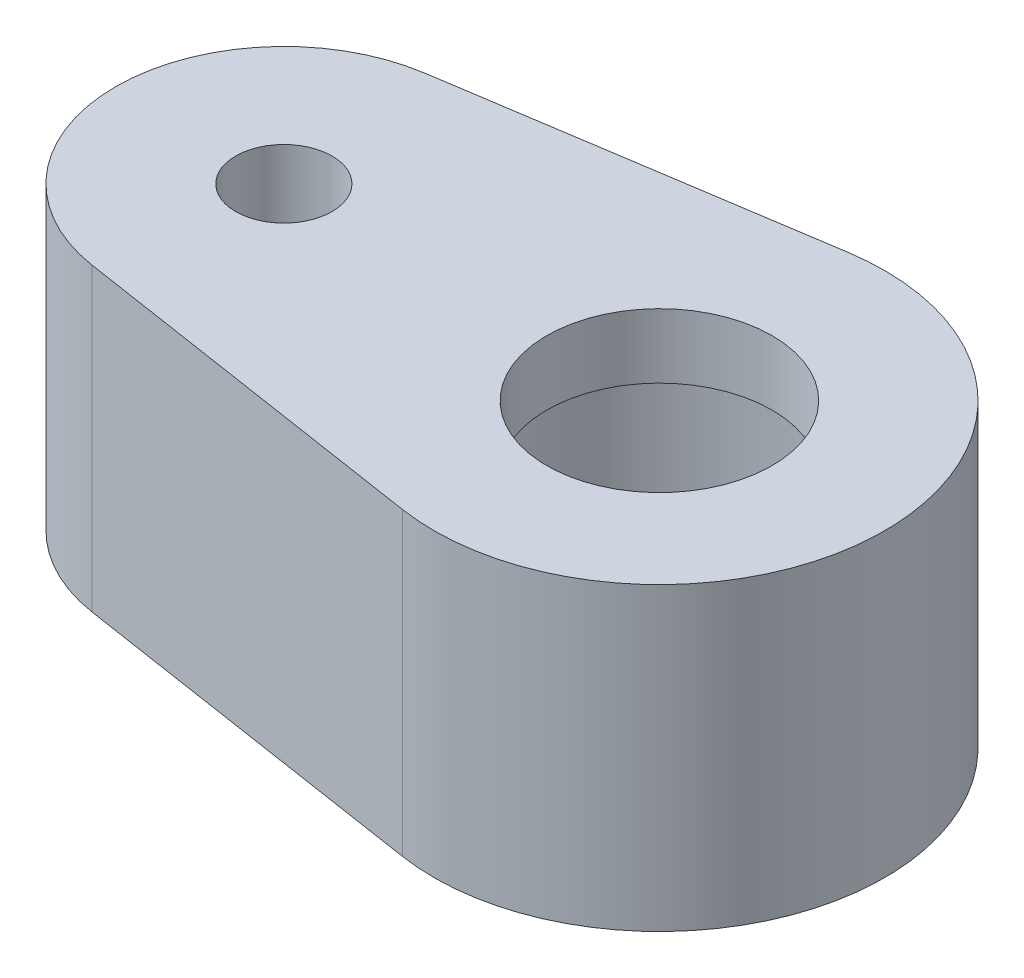
ISO-10303-21;
HEADER;
FILE_DESCRIPTION(('STEP AP214'),'2;1');
FILE_NAME('part.step','',(''),(''),'','','');
FILE_SCHEMA(('AUTOMOTIVE_DESIGN { 1 0 10303 214 1 1 1 1 }'));
ENDSEC;
DATA;
#1=APPLICATION_CONTEXT('core data for automotive mechanical design processes');
#2=APPLICATION_PROTOCOL_DEFINITION('international standard','automotive_design',2000,#1);
#3=PRODUCT_CONTEXT('',#1,'mechanical');
#4=PRODUCT('Part','Part','',(#3));
#5=PRODUCT_RELATED_PRODUCT_CATEGORY('part','',(#4));
#6=PRODUCT_DEFINITION_FORMATION('','',#4);
#7=PRODUCT_DEFINITION_CONTEXT('part definition',#1,'design');
#8=PRODUCT_DEFINITION('design','',#6,#7);
#9=PRODUCT_DEFINITION_SHAPE('','',#8);
#10=(LENGTH_UNIT() NAMED_UNIT(*) SI_UNIT(.MILLI.,.METRE.));
#11=(NAMED_UNIT(*) PLANE_ANGLE_UNIT() SI_UNIT($,.RADIAN.));
#12=(NAMED_UNIT(*) SI_UNIT($,.STERADIAN.) SOLID_ANGLE_UNIT());
#13=UNCERTAINTY_MEASURE_WITH_UNIT(LENGTH_MEASURE(1.E-05),#10,'distance_accuracy_value','');
#14=(GEOMETRIC_REPRESENTATION_CONTEXT(3) GLOBAL_UNCERTAINTY_ASSIGNED_CONTEXT((#13)) GLOBAL_UNIT_ASSIGNED_CONTEXT((#10,
#11,#12)) REPRESENTATION_CONTEXT('',''));
#15=CARTESIAN_POINT('',(0.,0.,0.));
#16=DIRECTION('',(0.,0.,1.));
#17=DIRECTION('',(1.,0.,0.));
#18=AXIS2_PLACEMENT_3D('',#15,#16,#17);
#19=CARTESIAN_POINT('',(-2.5,-1.,0.));
#20=DIRECTION('',(0.,1.,0.));
#21=DIRECTION('',(0.,0.,1.));
#22=AXIS2_PLACEMENT_3D('',#19,#20,#21);
#23=CYLINDRICAL_SURFACE('',#22,1.12);
#24=DIRECTION('',(0.,1.,0.));
#25=VECTOR('',#24,1.);
#26=CARTESIAN_POINT('',(-2.67024,-1.,1.10698615275892));
#27=LINE('',#26,#25);
#28=CARTESIAN_POINT('',(-2.67024,-1.,1.10698615275892));
#29=VERTEX_POINT('',#28);
#30=CARTESIAN_POINT('',(-2.67024,1.,1.10698615275892));
#31=VERTEX_POINT('',#30);
#32=EDGE_CURVE('E36',#29,#31,#27,.T.);
#33=ORIENTED_EDGE('',*,*,#32,.T.);
#34=CARTESIAN_POINT('',(-2.5,1.,0.));
#35=DIRECTION('',(0.,1.,0.));
#36=DIRECTION('',(0.,0.,1.));
#37=AXIS2_PLACEMENT_3D('',#34,#35,#36);
#38=CIRCLE('',#37,1.12);
#39=CARTESIAN_POINT('',(-2.67024,1.,-1.10698615275892));
#40=VERTEX_POINT('',#39);
#41=EDGE_CURVE('E73',#40,#31,#38,.T.);
#42=ORIENTED_EDGE('',*,*,#41,.F.);
#43=DIRECTION('',(0.,1.,0.));
#44=VECTOR('',#43,1.);
#45=CARTESIAN_POINT('',(-2.67024,-1.,-1.10698615275892));
#46=LINE('',#45,#44);
#47=CARTESIAN_POINT('',(-2.67024,-1.,-1.10698615275892));
#48=VERTEX_POINT('',#47);
#49=EDGE_CURVE('E11',#48,#40,#46,.T.);
#50=ORIENTED_EDGE('',*,*,#49,.F.);
#51=CARTESIAN_POINT('',(-2.5,-1.,0.));
#52=DIRECTION('',(0.,1.,0.));
#53=DIRECTION('',(0.,0.,1.));
#54=AXIS2_PLACEMENT_3D('',#51,#52,#53);
#55=CIRCLE('',#54,1.12);
#56=EDGE_CURVE('E74',#48,#29,#55,.T.);
#57=ORIENTED_EDGE('',*,*,#56,.T.);
#58=EDGE_LOOP('',(#33,#42,#50,#57));
#59=FACE_BOUND('',#58,.T.);
#60=ADVANCED_FACE('F33',(#59),#23,.T.);
#61=CARTESIAN_POINT('',(-2.67024,-1.,-1.10698615275892));
#62=DIRECTION('',(-0.152,0.,-0.988380493534752));
#63=DIRECTION('',(-0.988380493534752,0.,0.152));
#64=AXIS2_PLACEMENT_3D('',#61,#62,#63);
#65=PLANE('',#64);
#66=ORIENTED_EDGE('',*,*,#49,.T.);
#67=DIRECTION('',(-0.988380493534752,0.,0.152));
#68=VECTOR('',#67,1.);
#69=CARTESIAN_POINT('',(-2.67024,1.,-1.10698615275892));
#70=LINE('',#69,#68);
#71=CARTESIAN_POINT('',(-0.228,1.,-1.48257074030213));
#72=VERTEX_POINT('',#71);
#73=EDGE_CURVE('E90',#72,#40,#70,.T.);
#74=ORIENTED_EDGE('',*,*,#73,.F.);
#75=DIRECTION('',(0.,1.,0.));
#76=VECTOR('',#75,1.);
#77=CARTESIAN_POINT('',(-0.228,-1.,-1.48257074030213));
#78=LINE('',#77,#76);
#79=CARTESIAN_POINT('',(-0.228,-1.,-1.48257074030213));
#80=VERTEX_POINT('',#79);
#81=EDGE_CURVE('E41',#80,#72,#78,.T.);
#82=ORIENTED_EDGE('',*,*,#81,.F.);
#83=DIRECTION('',(-0.988380493534752,0.,0.152));
#84=VECTOR('',#83,1.);
#85=CARTESIAN_POINT('',(-2.67024,-1.,-1.10698615275892));
#86=LINE('',#85,#84);
#87=EDGE_CURVE('E79',#80,#48,#86,.T.);
#88=ORIENTED_EDGE('',*,*,#87,.T.);
#89=EDGE_LOOP('',(#66,#74,#82,#88));
#90=FACE_BOUND('',#89,.T.);
#91=ADVANCED_FACE('F110',(#90),#65,.T.);
#92=CARTESIAN_POINT('',(0.,-1.,0.));
#93=DIRECTION('',(0.,1.,0.));
#94=DIRECTION('',(0.,0.,1.));
#95=AXIS2_PLACEMENT_3D('',#92,#93,#94);
#96=CYLINDRICAL_SURFACE('',#95,1.5);
#97=ORIENTED_EDGE('',*,*,#81,.T.);
#98=CARTESIAN_POINT('',(0.,1.,0.));
#99=DIRECTION('',(0.,1.,0.));
#100=DIRECTION('',(0.,0.,1.));
#101=AXIS2_PLACEMENT_3D('',#98,#99,#100);
#102=CIRCLE('',#101,1.5);
#103=CARTESIAN_POINT('',(-0.228,1.,1.48257074030213));
#104=VERTEX_POINT('',#103);
#105=EDGE_CURVE('E86',#104,#72,#102,.T.);
#106=ORIENTED_EDGE('',*,*,#105,.F.);
#107=DIRECTION('',(0.,1.,0.));
#108=VECTOR('',#107,1.);
#109=CARTESIAN_POINT('',(-0.228,-1.,1.48257074030213));
#110=LINE('',#109,#108);
#111=CARTESIAN_POINT('',(-0.228,-1.,1.48257074030213));
#112=VERTEX_POINT('',#111);
#113=EDGE_CURVE('E78',#112,#104,#110,.T.);
#114=ORIENTED_EDGE('',*,*,#113,.F.);
#115=CARTESIAN_POINT('',(0.,-1.,0.));
#116=DIRECTION('',(0.,1.,0.));
#117=DIRECTION('',(0.,0.,1.));
#118=AXIS2_PLACEMENT_3D('',#115,#116,#117);
#119=CIRCLE('',#118,1.5);
#120=EDGE_CURVE('E103',#112,#80,#119,.T.);
#121=ORIENTED_EDGE('',*,*,#120,.T.);
#122=EDGE_LOOP('',(#97,#106,#114,#121));
#123=FACE_BOUND('',#122,.T.);
#124=ADVANCED_FACE('F107',(#123),#96,.T.);
#125=CARTESIAN_POINT('',(-2.67024,-1.,1.10698615275892));
#126=DIRECTION('',(-0.152,0.,0.988380493534752));
#127=DIRECTION('',(0.988380493534752,0.,0.152));
#128=AXIS2_PLACEMENT_3D('',#125,#126,#127);
#129=PLANE('',#128);
#130=ORIENTED_EDGE('',*,*,#113,.T.);
#131=DIRECTION('',(0.988380493534752,0.,0.152));
#132=VECTOR('',#131,1.);
#133=CARTESIAN_POINT('',(-2.67024,1.,1.10698615275892));
#134=LINE('',#133,#132);
#135=EDGE_CURVE('E81',#31,#104,#134,.T.);
#136=ORIENTED_EDGE('',*,*,#135,.F.);
#137=ORIENTED_EDGE('',*,*,#32,.F.);
#138=DIRECTION('',(0.988380493534752,0.,0.152));
#139=VECTOR('',#138,1.);
#140=CARTESIAN_POINT('',(-2.67024,-1.,1.10698615275892));
#141=LINE('',#140,#139);
#142=EDGE_CURVE('E101',#29,#112,#141,.T.);
#143=ORIENTED_EDGE('',*,*,#142,.T.);
#144=EDGE_LOOP('',(#130,#136,#137,#143));
#145=FACE_BOUND('',#144,.T.);
#146=ADVANCED_FACE('F82',(#145),#129,.T.);
#147=CARTESIAN_POINT('',(-2.5,-1.,0.));
#148=DIRECTION('',(0.,1.,0.));
#149=DIRECTION('',(0.,0.,1.));
#150=AXIS2_PLACEMENT_3D('',#147,#148,#149);
#151=PLANE('',#150);
#152=CARTESIAN_POINT('',(-2.5,-1.,0.));
#153=DIRECTION('',(0.,1.,0.));
#154=DIRECTION('',(0.,0.,1.));
#155=AXIS2_PLACEMENT_3D('',#152,#153,#154);
#156=CIRCLE('',#155,0.3207);
#157=CARTESIAN_POINT('',(-2.5,-1.,0.3207));
#158=VERTEX_POINT('',#157);
#159=EDGE_CURVE('E219',#158,#158,#156,.F.);
#160=ORIENTED_EDGE('',*,*,#159,.F.);
#161=EDGE_LOOP('',(#160));
#162=FACE_BOUND('',#161,.T.);
#163=CARTESIAN_POINT('',(0.,-1.,0.));
#164=DIRECTION('',(0.,-1.,0.));
#165=DIRECTION('',(0.,0.,-1.));
#166=AXIS2_PLACEMENT_3D('',#163,#164,#165);
#167=CIRCLE('',#166,0.75);
#168=CARTESIAN_POINT('',(0.,-1.,-0.75));
#169=VERTEX_POINT('',#168);
#170=EDGE_CURVE('E229',#169,#169,#167,.T.);
#171=ORIENTED_EDGE('',*,*,#170,.F.);
#172=EDGE_LOOP('',(#171));
#173=FACE_BOUND('',#172,.T.);
#174=ORIENTED_EDGE('',*,*,#56,.F.);
#175=ORIENTED_EDGE('',*,*,#87,.F.);
#176=ORIENTED_EDGE('',*,*,#120,.F.);
#177=ORIENTED_EDGE('',*,*,#142,.F.);
#178=EDGE_LOOP('',(#174,#175,#176,#177));
#179=FACE_BOUND('',#178,.T.);
#180=ADVANCED_FACE('F112',(#162,#173,#179),#151,.F.);
#181=CARTESIAN_POINT('',(-2.5,1.,0.));
#182=DIRECTION('',(0.,1.,0.));
#183=DIRECTION('',(0.,0.,1.));
#184=AXIS2_PLACEMENT_3D('',#181,#182,#183);
#185=PLANE('',#184);
#186=CARTESIAN_POINT('',(-2.5,1.,0.));
#187=DIRECTION('',(0.,1.,0.));
#188=DIRECTION('',(0.,0.,1.));
#189=AXIS2_PLACEMENT_3D('',#186,#187,#188);
#190=CIRCLE('',#189,0.3207);
#191=CARTESIAN_POINT('',(-2.5,1.,0.3207));
#192=VERTEX_POINT('',#191);
#193=EDGE_CURVE('E217',#192,#192,#190,.T.);
#194=ORIENTED_EDGE('',*,*,#193,.F.);
#195=EDGE_LOOP('',(#194));
#196=FACE_BOUND('',#195,.T.);
#197=CARTESIAN_POINT('',(0.,1.,0.));
#198=DIRECTION('',(0.,-1.,0.));
#199=DIRECTION('',(0.,0.,-1.));
#200=AXIS2_PLACEMENT_3D('',#197,#198,#199);
#201=CIRCLE('',#200,0.75);
#202=CARTESIAN_POINT('',(0.,1.,-0.75));
#203=VERTEX_POINT('',#202);
#204=EDGE_CURVE('E232',#203,#203,#201,.T.);
#205=ORIENTED_EDGE('',*,*,#204,.T.);
#206=EDGE_LOOP('',(#205));
#207=FACE_BOUND('',#206,.T.);
#208=ORIENTED_EDGE('',*,*,#41,.T.);
#209=ORIENTED_EDGE('',*,*,#135,.T.);
#210=ORIENTED_EDGE('',*,*,#105,.T.);
#211=ORIENTED_EDGE('',*,*,#73,.T.);
#212=EDGE_LOOP('',(#208,#209,#210,#211));
#213=FACE_BOUND('',#212,.T.);
#214=ADVANCED_FACE('F89',(#196,#207,#213),#185,.T.);
#215=CARTESIAN_POINT('',(0.,-1.,0.));
#216=DIRECTION('',(0.,-1.,0.));
#217=DIRECTION('',(0.,0.,-1.));
#218=AXIS2_PLACEMENT_3D('',#215,#216,#217);
#219=CYLINDRICAL_SURFACE('',#218,1.145);
#220=CARTESIAN_POINT('',(0.,0.465,0.));
#221=DIRECTION('',(0.,-1.,0.));
#222=DIRECTION('',(0.,0.,-1.));
#223=AXIS2_PLACEMENT_3D('',#220,#221,#222);
#224=CIRCLE('',#223,1.145);
#225=CARTESIAN_POINT('',(0.,0.465,-1.145));
#226=VERTEX_POINT('',#225);
#227=EDGE_CURVE('E91',#226,#226,#224,.T.);
#228=ORIENTED_EDGE('',*,*,#227,.F.);
#229=EDGE_LOOP('',(#228));
#230=FACE_BOUND('',#229,.T.);
#231=CARTESIAN_POINT('',(0.,-0.465,0.));
#232=DIRECTION('',(0.,-1.,0.));
#233=DIRECTION('',(0.,0.,-1.));
#234=AXIS2_PLACEMENT_3D('',#231,#232,#233);
#235=CIRCLE('',#234,1.145);
#236=CARTESIAN_POINT('',(0.,-0.465,-1.145));
#237=VERTEX_POINT('',#236);
#238=EDGE_CURVE('E220',#237,#237,#235,.T.);
#239=ORIENTED_EDGE('',*,*,#238,.T.);
#240=EDGE_LOOP('',(#239));
#241=FACE_BOUND('',#240,.T.);
#242=ADVANCED_FACE('F120',(#230,#241),#219,.F.);
#243=CARTESIAN_POINT('',(0.,0.465,0.));
#244=DIRECTION('',(0.,-1.,0.));
#245=DIRECTION('',(0.,0.,-1.));
#246=AXIS2_PLACEMENT_3D('',#243,#244,#245);
#247=CONICAL_SURFACE('',#246,1.145,1.30899693899575);
#248=CARTESIAN_POINT('',(0.,0.570839931010292,0.));
#249=DIRECTION('',(0.,-1.,0.));
#250=DIRECTION('',(0.,0.,-1.));
#251=AXIS2_PLACEMENT_3D('',#248,#249,#250);
#252=CIRCLE('',#251,0.75);
#253=CARTESIAN_POINT('',(0.,0.570839931010292,-0.75));
#254=VERTEX_POINT('',#253);
#255=EDGE_CURVE('E94',#254,#254,#252,.T.);
#256=ORIENTED_EDGE('',*,*,#255,.F.);
#257=EDGE_LOOP('',(#256));
#258=FACE_BOUND('',#257,.T.);
#259=ORIENTED_EDGE('',*,*,#227,.T.);
#260=EDGE_LOOP('',(#259));
#261=FACE_BOUND('',#260,.T.);
#262=ADVANCED_FACE('F150',(#258,#261),#247,.F.);
#263=CARTESIAN_POINT('',(0.,-1.,0.));
#264=DIRECTION('',(0.,-1.,0.));
#265=DIRECTION('',(0.,0.,-1.));
#266=AXIS2_PLACEMENT_3D('',#263,#264,#265);
#267=CYLINDRICAL_SURFACE('',#266,0.75);
#268=ORIENTED_EDGE('',*,*,#204,.F.);
#269=EDGE_LOOP('',(#268));
#270=FACE_BOUND('',#269,.T.);
#271=ORIENTED_EDGE('',*,*,#255,.T.);
#272=EDGE_LOOP('',(#271));
#273=FACE_BOUND('',#272,.T.);
#274=ADVANCED_FACE('F161',(#270,#273),#267,.F.);
#275=CARTESIAN_POINT('',(0.,-1.,0.));
#276=DIRECTION('',(0.,-1.,0.));
#277=DIRECTION('',(0.,0.,-1.));
#278=AXIS2_PLACEMENT_3D('',#275,#276,#277);
#279=CYLINDRICAL_SURFACE('',#278,0.75);
#280=CARTESIAN_POINT('',(0.,-0.570839931010292,0.));
#281=DIRECTION('',(0.,-1.,0.));
#282=DIRECTION('',(0.,0.,-1.));
#283=AXIS2_PLACEMENT_3D('',#280,#281,#282);
#284=CIRCLE('',#283,0.75);
#285=CARTESIAN_POINT('',(0.,-0.570839931010292,-0.75));
#286=VERTEX_POINT('',#285);
#287=EDGE_CURVE('E223',#286,#286,#284,.T.);
#288=ORIENTED_EDGE('',*,*,#287,.F.);
#289=EDGE_LOOP('',(#288));
#290=FACE_BOUND('',#289,.T.);
#291=ORIENTED_EDGE('',*,*,#170,.T.);
#292=EDGE_LOOP('',(#291));
#293=FACE_BOUND('',#292,.T.);
#294=ADVANCED_FACE('F171',(#290,#293),#279,.F.);
#295=CARTESIAN_POINT('',(0.,-0.570839931010292,0.));
#296=DIRECTION('',(0.,1.,0.));
#297=DIRECTION('',(0.,0.,1.));
#298=AXIS2_PLACEMENT_3D('',#295,#296,#297);
#299=CONICAL_SURFACE('',#298,0.75,1.30899693899575);
#300=ORIENTED_EDGE('',*,*,#238,.F.);
#301=EDGE_LOOP('',(#300));
#302=FACE_BOUND('',#301,.T.);
#303=ORIENTED_EDGE('',*,*,#287,.T.);
#304=EDGE_LOOP('',(#303));
#305=FACE_BOUND('',#304,.T.);
#306=ADVANCED_FACE('F181',(#302,#305),#299,.F.);
#307=CARTESIAN_POINT('',(-2.5,-1.001,0.));
#308=DIRECTION('',(0.,1.,0.));
#309=DIRECTION('',(0.,0.,1.));
#310=AXIS2_PLACEMENT_3D('',#307,#308,#309);
#311=CYLINDRICAL_SURFACE('',#310,0.3207);
#312=ORIENTED_EDGE('',*,*,#193,.T.);
#313=EDGE_LOOP('',(#312));
#314=FACE_BOUND('',#313,.T.);
#315=ORIENTED_EDGE('',*,*,#159,.T.);
#316=EDGE_LOOP('',(#315));
#317=FACE_BOUND('',#316,.T.);
#318=ADVANCED_FACE('F190',(#314,#317),#311,.F.);
#319=CLOSED_SHELL('',(#60,#91,#124,#146,#180,#214,#242,#262,#274,#294,#306,#318));
#320=MANIFOLD_SOLID_BREP('B2',#319);
#321=ADVANCED_BREP_SHAPE_REPRESENTATION('',(#18,#320),#14);
#322=SHAPE_DEFINITION_REPRESENTATION(#9,#321);
ENDSEC;
END-ISO-10303-21;
